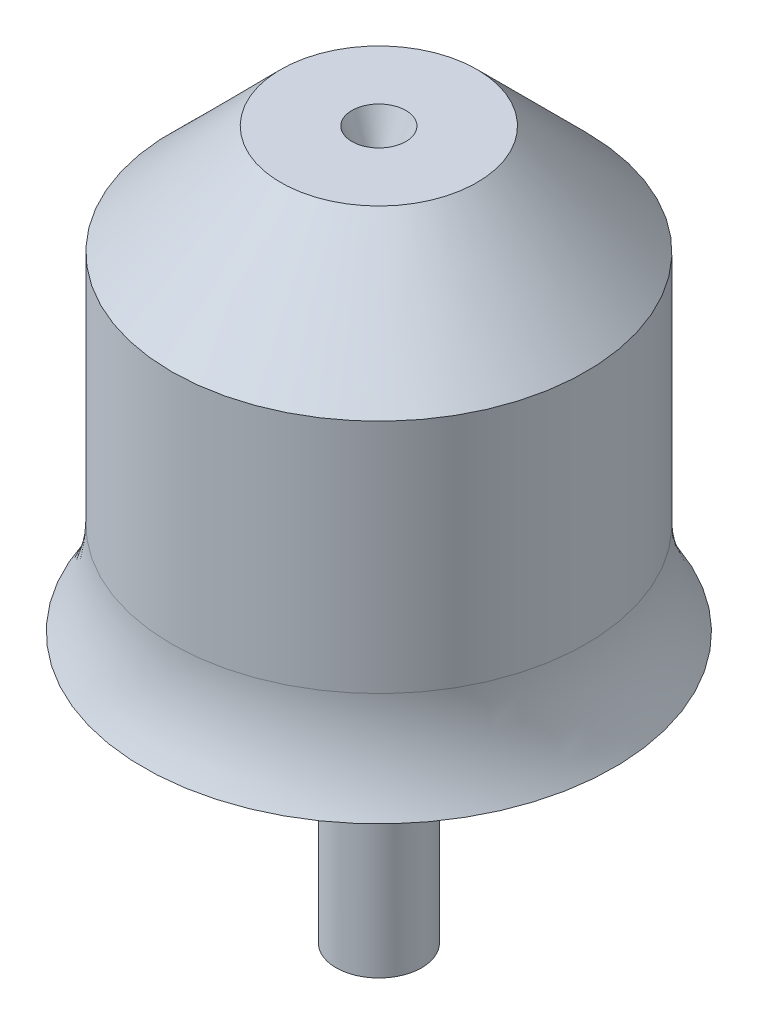
ISO-10303-21;
HEADER;
FILE_DESCRIPTION(('STEP AP214'),'2;1');
FILE_NAME('part.step','',(''),(''),'','','');
FILE_SCHEMA(('AUTOMOTIVE_DESIGN { 1 0 10303 214 1 1 1 1 }'));
ENDSEC;
DATA;
#1=APPLICATION_CONTEXT('core data for automotive mechanical design processes');
#2=APPLICATION_PROTOCOL_DEFINITION('international standard','automotive_design',2000,#1);
#3=PRODUCT_CONTEXT('',#1,'mechanical');
#4=PRODUCT('Part','Part','',(#3));
#5=PRODUCT_RELATED_PRODUCT_CATEGORY('part','',(#4));
#6=PRODUCT_DEFINITION_FORMATION('','',#4);
#7=PRODUCT_DEFINITION_CONTEXT('part definition',#1,'design');
#8=PRODUCT_DEFINITION('design','',#6,#7);
#9=PRODUCT_DEFINITION_SHAPE('','',#8);
#10=(LENGTH_UNIT() NAMED_UNIT(*) SI_UNIT(.MILLI.,.METRE.));
#11=(NAMED_UNIT(*) PLANE_ANGLE_UNIT() SI_UNIT($,.RADIAN.));
#12=(NAMED_UNIT(*) SI_UNIT($,.STERADIAN.) SOLID_ANGLE_UNIT());
#13=UNCERTAINTY_MEASURE_WITH_UNIT(LENGTH_MEASURE(1.E-05),#10,'distance_accuracy_value','');
#14=(GEOMETRIC_REPRESENTATION_CONTEXT(3) GLOBAL_UNCERTAINTY_ASSIGNED_CONTEXT((#13)) GLOBAL_UNIT_ASSIGNED_CONTEXT((#10,
#11,#12)) REPRESENTATION_CONTEXT('',''));
#15=CARTESIAN_POINT('',(0.,0.,0.));
#16=DIRECTION('',(0.,0.,1.));
#17=DIRECTION('',(1.,0.,0.));
#18=AXIS2_PLACEMENT_3D('',#15,#16,#17);
#19=CARTESIAN_POINT('',(0.,40.,0.));
#20=DIRECTION('',(0.,-1.,0.));
#21=DIRECTION('',(0.,0.,-1.));
#22=AXIS2_PLACEMENT_3D('',#19,#20,#21);
#23=CYLINDRICAL_SURFACE('',#22,6.35);
#24=CARTESIAN_POINT('',(0.,30.,0.));
#25=DIRECTION('',(0.,-1.,0.));
#26=DIRECTION('',(0.,0.,-1.));
#27=AXIS2_PLACEMENT_3D('',#24,#25,#26);
#28=CIRCLE('',#27,6.35);
#29=CARTESIAN_POINT('',(0.,30.,-6.35));
#30=VERTEX_POINT('',#29);
#31=EDGE_CURVE('E12',#30,#30,#28,.T.);
#32=ORIENTED_EDGE('',*,*,#31,.T.);
#33=EDGE_LOOP('',(#32));
#34=FACE_BOUND('',#33,.T.);
#35=CARTESIAN_POINT('',(0.,0.,0.));
#36=DIRECTION('',(0.,1.,0.));
#37=DIRECTION('',(0.,0.,1.));
#38=AXIS2_PLACEMENT_3D('',#35,#36,#37);
#39=CIRCLE('',#38,6.35);
#40=CARTESIAN_POINT('',(0.,0.,6.35));
#41=VERTEX_POINT('',#40);
#42=EDGE_CURVE('E125',#41,#41,#39,.T.);
#43=ORIENTED_EDGE('',*,*,#42,.T.);
#44=EDGE_LOOP('',(#43));
#45=FACE_BOUND('',#44,.T.);
#46=ADVANCED_FACE('F42',(#34,#45),#23,.T.);
#47=CARTESIAN_POINT('',(0.,0.,0.));
#48=DIRECTION('',(0.,1.,0.));
#49=DIRECTION('',(0.,0.,1.));
#50=AXIS2_PLACEMENT_3D('',#47,#48,#49);
#51=PLANE('',#50);
#52=ORIENTED_EDGE('',*,*,#42,.F.);
#53=EDGE_LOOP('',(#52));
#54=FACE_BOUND('',#53,.T.);
#55=ADVANCED_FACE('F70',(#54),#51,.F.);
#56=CARTESIAN_POINT('',(0.,105.,0.));
#57=DIRECTION('',(0.,1.,0.));
#58=DIRECTION('',(0.,0.,1.));
#59=AXIS2_PLACEMENT_3D('',#56,#57,#58);
#60=PLANE('',#59);
#61=CARTESIAN_POINT('',(0.,105.,0.));
#62=DIRECTION('',(0.,1.,0.));
#63=DIRECTION('',(0.,0.,1.));
#64=AXIS2_PLACEMENT_3D('',#61,#62,#63);
#65=CIRCLE('',#64,4.);
#66=CARTESIAN_POINT('',(0.,105.,4.));
#67=VERTEX_POINT('',#66);
#68=EDGE_CURVE('E107',#67,#67,#65,.T.);
#69=ORIENTED_EDGE('',*,*,#68,.F.);
#70=EDGE_LOOP('',(#69));
#71=FACE_BOUND('',#70,.T.);
#72=CARTESIAN_POINT('',(0.,105.,0.));
#73=DIRECTION('',(0.,-1.,0.));
#74=DIRECTION('',(0.,0.,-1.));
#75=AXIS2_PLACEMENT_3D('',#72,#73,#74);
#76=CIRCLE('',#75,14.55);
#77=CARTESIAN_POINT('',(0.,105.,-14.55));
#78=VERTEX_POINT('',#77);
#79=EDGE_CURVE('E121',#78,#78,#76,.T.);
#80=ORIENTED_EDGE('',*,*,#79,.F.);
#81=EDGE_LOOP('',(#80));
#82=FACE_BOUND('',#81,.T.);
#83=ADVANCED_FACE('F75',(#71,#82),#60,.T.);
#84=CARTESIAN_POINT('',(0.,88.8,0.));
#85=DIRECTION('',(0.,-1.,0.));
#86=DIRECTION('',(0.,0.,-1.));
#87=AXIS2_PLACEMENT_3D('',#84,#85,#86);
#88=CONICAL_SURFACE('',#87,30.75,0.785398163397447);
#89=ORIENTED_EDGE('',*,*,#79,.T.);
#90=EDGE_LOOP('',(#89));
#91=FACE_BOUND('',#90,.T.);
#92=CARTESIAN_POINT('',(0.,88.8,0.));
#93=DIRECTION('',(0.,-1.,0.));
#94=DIRECTION('',(0.,0.,-1.));
#95=AXIS2_PLACEMENT_3D('',#92,#93,#94);
#96=CIRCLE('',#95,30.75);
#97=CARTESIAN_POINT('',(0.,88.8,-30.75));
#98=VERTEX_POINT('',#97);
#99=EDGE_CURVE('E112',#98,#98,#96,.T.);
#100=ORIENTED_EDGE('',*,*,#99,.F.);
#101=EDGE_LOOP('',(#100));
#102=FACE_BOUND('',#101,.T.);
#103=ADVANCED_FACE('F82',(#91,#102),#88,.T.);
#104=CARTESIAN_POINT('',(0.,40.,0.));
#105=DIRECTION('',(0.,-1.,0.));
#106=DIRECTION('',(0.,0.,-1.));
#107=AXIS2_PLACEMENT_3D('',#104,#105,#106);
#108=CYLINDRICAL_SURFACE('',#107,30.75);
#109=ORIENTED_EDGE('',*,*,#99,.T.);
#110=EDGE_LOOP('',(#109));
#111=FACE_BOUND('',#110,.T.);
#112=CARTESIAN_POINT('',(0.,53.8,0.));
#113=DIRECTION('',(0.,-1.,0.));
#114=DIRECTION('',(0.,0.,-1.));
#115=AXIS2_PLACEMENT_3D('',#112,#113,#114);
#116=CIRCLE('',#115,30.75);
#117=CARTESIAN_POINT('',(0.,53.8,-30.75));
#118=VERTEX_POINT('',#117);
#119=EDGE_CURVE('E106',#118,#118,#116,.T.);
#120=ORIENTED_EDGE('',*,*,#119,.F.);
#121=EDGE_LOOP('',(#120));
#122=FACE_BOUND('',#121,.T.);
#123=ADVANCED_FACE('F86',(#111,#122),#108,.T.);
#124=CARTESIAN_POINT('',(0.,53.8,0.));
#125=DIRECTION('',(0.,-1.,0.));
#126=DIRECTION('',(0.,0.,-1.));
#127=AXIS2_PLACEMENT_3D('',#124,#125,#126);
#128=TOROIDAL_SURFACE('',#127,55.75,25.);
#129=ORIENTED_EDGE('',*,*,#119,.T.);
#130=EDGE_LOOP('',(#129));
#131=FACE_BOUND('',#130,.T.);
#132=CARTESIAN_POINT('',(0.,40.,0.));
#133=DIRECTION('',(0.,-1.,0.));
#134=DIRECTION('',(0.,0.,-1.));
#135=AXIS2_PLACEMENT_3D('',#132,#133,#134);
#136=CIRCLE('',#135,34.9038972467274);
#137=CARTESIAN_POINT('',(0.,40.,-34.9038972467274));
#138=VERTEX_POINT('',#137);
#139=EDGE_CURVE('E103',#138,#138,#136,.T.);
#140=ORIENTED_EDGE('',*,*,#139,.F.);
#141=EDGE_LOOP('',(#140));
#142=FACE_BOUND('',#141,.T.);
#143=ADVANCED_FACE('F90',(#131,#142),#128,.F.);
#144=CARTESIAN_POINT('',(0.,40.,0.));
#145=DIRECTION('',(0.,-1.,0.));
#146=DIRECTION('',(0.,0.,-1.));
#147=AXIS2_PLACEMENT_3D('',#144,#145,#146);
#148=PLANE('',#147);
#149=CARTESIAN_POINT('',(0.,40.,0.));
#150=DIRECTION('',(0.,-1.,0.));
#151=DIRECTION('',(0.,0.,-1.));
#152=AXIS2_PLACEMENT_3D('',#149,#150,#151);
#153=CIRCLE('',#152,16.35);
#154=CARTESIAN_POINT('',(0.,40.,-16.35));
#155=VERTEX_POINT('',#154);
#156=EDGE_CURVE('E53',#155,#155,#153,.F.);
#157=ORIENTED_EDGE('',*,*,#156,.T.);
#158=EDGE_LOOP('',(#157));
#159=FACE_BOUND('',#158,.T.);
#160=ORIENTED_EDGE('',*,*,#139,.T.);
#161=EDGE_LOOP('',(#160));
#162=FACE_BOUND('',#161,.T.);
#163=ADVANCED_FACE('F64',(#159,#162),#148,.T.);
#164=CARTESIAN_POINT('',(0.,30.,0.));
#165=DIRECTION('',(0.,-1.,0.));
#166=DIRECTION('',(0.,0.,-1.));
#167=AXIS2_PLACEMENT_3D('',#164,#165,#166);
#168=TOROIDAL_SURFACE('',#167,16.35,10.);
#169=ORIENTED_EDGE('',*,*,#31,.F.);
#170=EDGE_LOOP('',(#169));
#171=FACE_BOUND('',#170,.T.);
#172=ORIENTED_EDGE('',*,*,#156,.F.);
#173=EDGE_LOOP('',(#172));
#174=FACE_BOUND('',#173,.T.);
#175=ADVANCED_FACE('F44',(#171,#174),#168,.F.);
#176=CARTESIAN_POINT('',(0.,95.,0.));
#177=DIRECTION('',(0.,1.,0.));
#178=DIRECTION('',(0.,0.,1.));
#179=AXIS2_PLACEMENT_3D('',#176,#177,#178);
#180=CONICAL_SURFACE('',#179,0.,0.380506377112365);
#181=ORIENTED_EDGE('',*,*,#68,.T.);
#182=EDGE_LOOP('',(#181));
#183=FACE_BOUND('',#182,.T.);
#184=CARTESIAN_POINT('',(0.,95.,0.));
#185=VERTEX_POINT('',#184);
#186=VERTEX_LOOP('',#185);
#187=FACE_BOUND('',#186,.T.);
#188=ADVANCED_FACE('F57',(#183,#187),#180,.F.);
#189=CLOSED_SHELL('',(#46,#55,#83,#103,#123,#143,#163,#175,#188));
#190=MANIFOLD_SOLID_BREP('B2',#189);
#191=ADVANCED_BREP_SHAPE_REPRESENTATION('',(#18,#190),#14);
#192=SHAPE_DEFINITION_REPRESENTATION(#9,#191);
ENDSEC;
END-ISO-10303-21;
